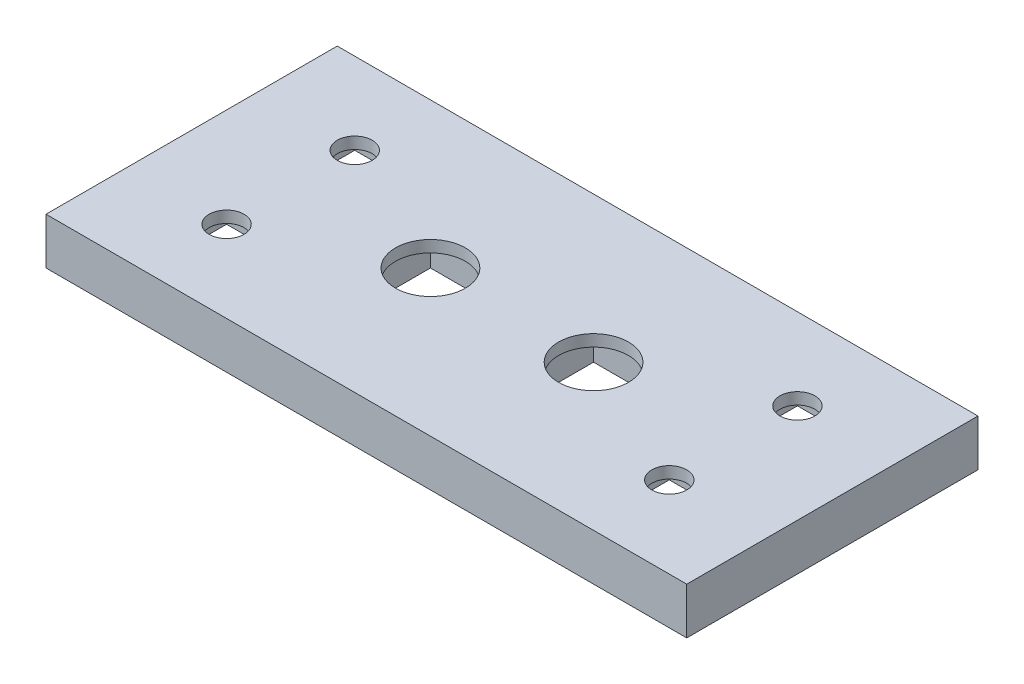
ISO-10303-21;
HEADER;
FILE_DESCRIPTION(('STEP AP214'),'2;1');
FILE_NAME('part.step','',(''),(''),'','','');
FILE_SCHEMA(('AUTOMOTIVE_DESIGN { 1 0 10303 214 1 1 1 1 }'));
ENDSEC;
DATA;
#1=APPLICATION_CONTEXT('core data for automotive mechanical design processes');
#2=APPLICATION_PROTOCOL_DEFINITION('international standard','automotive_design',2000,#1);
#3=PRODUCT_CONTEXT('',#1,'mechanical');
#4=PRODUCT('Part','Part','',(#3));
#5=PRODUCT_RELATED_PRODUCT_CATEGORY('part','',(#4));
#6=PRODUCT_DEFINITION_FORMATION('','',#4);
#7=PRODUCT_DEFINITION_CONTEXT('part definition',#1,'design');
#8=PRODUCT_DEFINITION('design','',#6,#7);
#9=PRODUCT_DEFINITION_SHAPE('','',#8);
#10=(LENGTH_UNIT() NAMED_UNIT(*) SI_UNIT(.MILLI.,.METRE.));
#11=(NAMED_UNIT(*) PLANE_ANGLE_UNIT() SI_UNIT($,.RADIAN.));
#12=(NAMED_UNIT(*) SI_UNIT($,.STERADIAN.) SOLID_ANGLE_UNIT());
#13=UNCERTAINTY_MEASURE_WITH_UNIT(LENGTH_MEASURE(1.E-05),#10,'distance_accuracy_value','');
#14=(GEOMETRIC_REPRESENTATION_CONTEXT(3) GLOBAL_UNCERTAINTY_ASSIGNED_CONTEXT((#13)) GLOBAL_UNIT_ASSIGNED_CONTEXT((#10,
#11,#12)) REPRESENTATION_CONTEXT('',''));
#15=CARTESIAN_POINT('',(0.,0.,0.));
#16=DIRECTION('',(0.,0.,1.));
#17=DIRECTION('',(1.,0.,0.));
#18=AXIS2_PLACEMENT_3D('',#15,#16,#17);
#19=CARTESIAN_POINT('',(0.,4.,0.));
#20=DIRECTION('',(0.,-1.,0.));
#21=DIRECTION('',(0.,0.,-1.));
#22=AXIS2_PLACEMENT_3D('',#19,#20,#21);
#23=PLANE('',#22);
#24=CARTESIAN_POINT('',(34.5,4.,-12.5));
#25=DIRECTION('',(0.,-1.,0.));
#26=DIRECTION('',(0.,0.,-1.));
#27=AXIS2_PLACEMENT_3D('',#24,#25,#26);
#28=CIRCLE('',#27,3.);
#29=CARTESIAN_POINT('',(34.5,4.,-15.5));
#30=VERTEX_POINT('',#29);
#31=EDGE_CURVE('E635',#30,#30,#28,.T.);
#32=ORIENTED_EDGE('',*,*,#31,.T.);
#33=EDGE_LOOP('',(#32));
#34=FACE_BOUND('',#33,.T.);
#35=CARTESIAN_POINT('',(46.5,4.,-7.));
#36=DIRECTION('',(0.,1.,0.));
#37=DIRECTION('',(0.,0.,1.));
#38=AXIS2_PLACEMENT_3D('',#35,#36,#37);
#39=CIRCLE('',#38,1.5);
#40=CARTESIAN_POINT('',(46.5,4.,-5.5));
#41=VERTEX_POINT('',#40);
#42=EDGE_CURVE('E1064',#41,#41,#39,.T.);
#43=ORIENTED_EDGE('',*,*,#42,.F.);
#44=EDGE_LOOP('',(#43));
#45=FACE_BOUND('',#44,.T.);
#46=DIRECTION('',(0.,0.,-1.));
#47=VECTOR('',#46,1.);
#48=CARTESIAN_POINT('',(0.,4.,0.));
#49=LINE('',#48,#47);
#50=CARTESIAN_POINT('',(0.,4.,0.));
#51=VERTEX_POINT('',#50);
#52=CARTESIAN_POINT('',(0.,4.,-25.));
#53=VERTEX_POINT('',#52);
#54=EDGE_CURVE('E487',#51,#53,#49,.T.);
#55=ORIENTED_EDGE('',*,*,#54,.F.);
#56=DIRECTION('',(1.,0.,0.));
#57=VECTOR('',#56,1.);
#58=CARTESIAN_POINT('',(0.,4.,0.));
#59=LINE('',#58,#57);
#60=CARTESIAN_POINT('',(55.,4.,0.));
#61=VERTEX_POINT('',#60);
#62=EDGE_CURVE('E499',#51,#61,#59,.T.);
#63=ORIENTED_EDGE('',*,*,#62,.T.);
#64=DIRECTION('',(0.,0.,-1.));
#65=VECTOR('',#64,1.);
#66=CARTESIAN_POINT('',(55.,4.,0.));
#67=LINE('',#66,#65);
#68=CARTESIAN_POINT('',(55.,4.,-25.));
#69=VERTEX_POINT('',#68);
#70=EDGE_CURVE('E496',#61,#69,#67,.T.);
#71=ORIENTED_EDGE('',*,*,#70,.T.);
#72=DIRECTION('',(1.,0.,0.));
#73=VECTOR('',#72,1.);
#74=CARTESIAN_POINT('',(0.,4.,-25.));
#75=LINE('',#74,#73);
#76=EDGE_CURVE('E491',#53,#69,#75,.T.);
#77=ORIENTED_EDGE('',*,*,#76,.F.);
#78=EDGE_LOOP('',(#55,#63,#71,#77));
#79=FACE_BOUND('',#78,.T.);
#80=CARTESIAN_POINT('',(8.5,4.,-18.));
#81=DIRECTION('',(0.,1.,0.));
#82=DIRECTION('',(0.,0.,1.));
#83=AXIS2_PLACEMENT_3D('',#80,#81,#82);
#84=CIRCLE('',#83,1.5);
#85=CARTESIAN_POINT('',(8.5,4.,-16.5));
#86=VERTEX_POINT('',#85);
#87=EDGE_CURVE('E619',#86,#86,#84,.T.);
#88=ORIENTED_EDGE('',*,*,#87,.F.);
#89=EDGE_LOOP('',(#88));
#90=FACE_BOUND('',#89,.T.);
#91=CARTESIAN_POINT('',(46.5,4.,-18.));
#92=DIRECTION('',(0.,-1.,0.));
#93=DIRECTION('',(0.,0.,-1.));
#94=AXIS2_PLACEMENT_3D('',#91,#92,#93);
#95=CIRCLE('',#94,1.5);
#96=CARTESIAN_POINT('',(46.5,4.,-19.5));
#97=VERTEX_POINT('',#96);
#98=EDGE_CURVE('E623',#97,#97,#95,.T.);
#99=ORIENTED_EDGE('',*,*,#98,.T.);
#100=EDGE_LOOP('',(#99));
#101=FACE_BOUND('',#100,.T.);
#102=CARTESIAN_POINT('',(20.5,4.,-12.5));
#103=DIRECTION('',(0.,1.,0.));
#104=DIRECTION('',(0.,0.,1.));
#105=AXIS2_PLACEMENT_3D('',#102,#103,#104);
#106=CIRCLE('',#105,3.);
#107=CARTESIAN_POINT('',(20.5,4.,-9.5));
#108=VERTEX_POINT('',#107);
#109=EDGE_CURVE('E627',#108,#108,#106,.T.);
#110=ORIENTED_EDGE('',*,*,#109,.F.);
#111=EDGE_LOOP('',(#110));
#112=FACE_BOUND('',#111,.T.);
#113=CARTESIAN_POINT('',(8.5,4.,-7.));
#114=DIRECTION('',(0.,-1.,0.));
#115=DIRECTION('',(0.,0.,-1.));
#116=AXIS2_PLACEMENT_3D('',#113,#114,#115);
#117=CIRCLE('',#116,1.5);
#118=CARTESIAN_POINT('',(8.5,4.,-8.5));
#119=VERTEX_POINT('',#118);
#120=EDGE_CURVE('E630',#119,#119,#117,.T.);
#121=ORIENTED_EDGE('',*,*,#120,.T.);
#122=EDGE_LOOP('',(#121));
#123=FACE_BOUND('',#122,.T.);
#124=ADVANCED_FACE('F39',(#34,#45,#79,#90,#101,#112,#123),#23,.F.);
#125=CARTESIAN_POINT('',(0.,0.,0.));
#126=DIRECTION('',(0.,-1.,0.));
#127=DIRECTION('',(0.,0.,-1.));
#128=AXIS2_PLACEMENT_3D('',#125,#126,#127);
#129=PLANE('',#128);
#130=DIRECTION('',(0.,0.,-1.));
#131=VECTOR('',#130,1.);
#132=CARTESIAN_POINT('',(42.5,0.,0.));
#133=LINE('',#132,#131);
#134=CARTESIAN_POINT('',(42.5,0.,-14.));
#135=VERTEX_POINT('',#134);
#136=CARTESIAN_POINT('',(42.5,0.,-22.));
#137=VERTEX_POINT('',#136);
#138=EDGE_CURVE('E57',#135,#137,#133,.T.);
#139=ORIENTED_EDGE('',*,*,#138,.F.);
#140=DIRECTION('',(-1.,0.,0.));
#141=VECTOR('',#140,1.);
#142=CARTESIAN_POINT('',(0.,0.,-14.));
#143=LINE('',#142,#141);
#144=CARTESIAN_POINT('',(50.5,0.,-14.));
#145=VERTEX_POINT('',#144);
#146=EDGE_CURVE('E298',#145,#135,#143,.T.);
#147=ORIENTED_EDGE('',*,*,#146,.F.);
#148=DIRECTION('',(0.,0.,-1.));
#149=VECTOR('',#148,1.);
#150=CARTESIAN_POINT('',(50.5,0.,0.));
#151=LINE('',#150,#149);
#152=CARTESIAN_POINT('',(50.5,0.,-22.));
#153=VERTEX_POINT('',#152);
#154=EDGE_CURVE('E293',#145,#153,#151,.T.);
#155=ORIENTED_EDGE('',*,*,#154,.T.);
#156=DIRECTION('',(-1.,0.,0.));
#157=VECTOR('',#156,1.);
#158=CARTESIAN_POINT('',(0.,0.,-22.));
#159=LINE('',#158,#157);
#160=EDGE_CURVE('E289',#153,#137,#159,.T.);
#161=ORIENTED_EDGE('',*,*,#160,.T.);
#162=EDGE_LOOP('',(#139,#147,#155,#161));
#163=FACE_BOUND('',#162,.T.);
#164=DIRECTION('',(-1.,0.,0.));
#165=VECTOR('',#164,1.);
#166=CARTESIAN_POINT('',(0.,0.,-8.5));
#167=LINE('',#166,#165);
#168=CARTESIAN_POINT('',(38.5,0.,-8.5));
#169=VERTEX_POINT('',#168);
#170=CARTESIAN_POINT('',(30.5,0.,-8.5));
#171=VERTEX_POINT('',#170);
#172=EDGE_CURVE('E65',#169,#171,#167,.T.);
#173=ORIENTED_EDGE('',*,*,#172,.F.);
#174=DIRECTION('',(0.,0.,-1.));
#175=VECTOR('',#174,1.);
#176=CARTESIAN_POINT('',(38.5,0.,0.));
#177=LINE('',#176,#175);
#178=CARTESIAN_POINT('',(38.5,0.,-16.5));
#179=VERTEX_POINT('',#178);
#180=EDGE_CURVE('E340',#169,#179,#177,.T.);
#181=ORIENTED_EDGE('',*,*,#180,.T.);
#182=DIRECTION('',(-1.,0.,0.));
#183=VECTOR('',#182,1.);
#184=CARTESIAN_POINT('',(0.,0.,-16.5));
#185=LINE('',#184,#183);
#186=CARTESIAN_POINT('',(30.5,0.,-16.5));
#187=VERTEX_POINT('',#186);
#188=EDGE_CURVE('E335',#179,#187,#185,.T.);
#189=ORIENTED_EDGE('',*,*,#188,.T.);
#190=DIRECTION('',(0.,0.,-1.));
#191=VECTOR('',#190,1.);
#192=CARTESIAN_POINT('',(30.5,0.,0.));
#193=LINE('',#192,#191);
#194=EDGE_CURVE('E331',#171,#187,#193,.T.);
#195=ORIENTED_EDGE('',*,*,#194,.F.);
#196=EDGE_LOOP('',(#173,#181,#189,#195));
#197=FACE_BOUND('',#196,.T.);
#198=DIRECTION('',(1.,0.,0.));
#199=VECTOR('',#198,1.);
#200=CARTESIAN_POINT('',(0.,0.,-11.));
#201=LINE('',#200,#199);
#202=CARTESIAN_POINT('',(4.5,0.,-11.));
#203=VERTEX_POINT('',#202);
#204=CARTESIAN_POINT('',(12.5,0.,-11.));
#205=VERTEX_POINT('',#204);
#206=EDGE_CURVE('E321',#203,#205,#201,.T.);
#207=ORIENTED_EDGE('',*,*,#206,.F.);
#208=DIRECTION('',(0.,0.,1.));
#209=VECTOR('',#208,1.);
#210=CARTESIAN_POINT('',(4.5,0.,0.));
#211=LINE('',#210,#209);
#212=CARTESIAN_POINT('',(4.5,0.,-3.));
#213=VERTEX_POINT('',#212);
#214=EDGE_CURVE('E382',#203,#213,#211,.T.);
#215=ORIENTED_EDGE('',*,*,#214,.T.);
#216=DIRECTION('',(1.,0.,0.));
#217=VECTOR('',#216,1.);
#218=CARTESIAN_POINT('',(0.,0.,-3.));
#219=LINE('',#218,#217);
#220=CARTESIAN_POINT('',(12.5,0.,-3.));
#221=VERTEX_POINT('',#220);
#222=EDGE_CURVE('E377',#213,#221,#219,.T.);
#223=ORIENTED_EDGE('',*,*,#222,.T.);
#224=DIRECTION('',(0.,0.,1.));
#225=VECTOR('',#224,1.);
#226=CARTESIAN_POINT('',(12.5,0.,0.));
#227=LINE('',#226,#225);
#228=EDGE_CURVE('E373',#205,#221,#227,.T.);
#229=ORIENTED_EDGE('',*,*,#228,.F.);
#230=EDGE_LOOP('',(#207,#215,#223,#229));
#231=FACE_BOUND('',#230,.T.);
#232=DIRECTION('',(-1.,0.,0.));
#233=VECTOR('',#232,1.);
#234=CARTESIAN_POINT('',(0.,0.,-3.));
#235=LINE('',#234,#233);
#236=CARTESIAN_POINT('',(50.5,0.,-3.));
#237=VERTEX_POINT('',#236);
#238=CARTESIAN_POINT('',(42.5,0.,-3.));
#239=VERTEX_POINT('',#238);
#240=EDGE_CURVE('E304',#237,#239,#235,.T.);
#241=ORIENTED_EDGE('',*,*,#240,.F.);
#242=DIRECTION('',(0.,0.,1.));
#243=VECTOR('',#242,1.);
#244=CARTESIAN_POINT('',(50.5,0.,0.));
#245=LINE('',#244,#243);
#246=CARTESIAN_POINT('',(50.5,0.,-11.));
#247=VERTEX_POINT('',#246);
#248=EDGE_CURVE('E462',#247,#237,#245,.T.);
#249=ORIENTED_EDGE('',*,*,#248,.F.);
#250=DIRECTION('',(-1.,0.,0.));
#251=VECTOR('',#250,1.);
#252=CARTESIAN_POINT('',(0.,0.,-11.));
#253=LINE('',#252,#251);
#254=CARTESIAN_POINT('',(42.5,0.,-11.));
#255=VERTEX_POINT('',#254);
#256=EDGE_CURVE('E466',#247,#255,#253,.T.);
#257=ORIENTED_EDGE('',*,*,#256,.T.);
#258=DIRECTION('',(0.,0.,1.));
#259=VECTOR('',#258,1.);
#260=CARTESIAN_POINT('',(42.5,0.,0.));
#261=LINE('',#260,#259);
#262=EDGE_CURVE('E448',#255,#239,#261,.T.);
#263=ORIENTED_EDGE('',*,*,#262,.T.);
#264=EDGE_LOOP('',(#241,#249,#257,#263));
#265=FACE_BOUND('',#264,.T.);
#266=DIRECTION('',(0.,0.,-1.));
#267=VECTOR('',#266,1.);
#268=CARTESIAN_POINT('',(0.,0.,0.));
#269=LINE('',#268,#267);
#270=CARTESIAN_POINT('',(0.,0.,0.));
#271=VERTEX_POINT('',#270);
#272=CARTESIAN_POINT('',(0.,0.,-25.));
#273=VERTEX_POINT('',#272);
#274=EDGE_CURVE('E486',#271,#273,#269,.T.);
#275=ORIENTED_EDGE('',*,*,#274,.T.);
#276=DIRECTION('',(1.,0.,0.));
#277=VECTOR('',#276,1.);
#278=CARTESIAN_POINT('',(0.,0.,-25.));
#279=LINE('',#278,#277);
#280=CARTESIAN_POINT('',(55.,0.,-25.));
#281=VERTEX_POINT('',#280);
#282=EDGE_CURVE('E506',#273,#281,#279,.T.);
#283=ORIENTED_EDGE('',*,*,#282,.T.);
#284=DIRECTION('',(0.,0.,-1.));
#285=VECTOR('',#284,1.);
#286=CARTESIAN_POINT('',(55.,0.,0.));
#287=LINE('',#286,#285);
#288=CARTESIAN_POINT('',(55.,0.,0.));
#289=VERTEX_POINT('',#288);
#290=EDGE_CURVE('E510',#289,#281,#287,.T.);
#291=ORIENTED_EDGE('',*,*,#290,.F.);
#292=DIRECTION('',(1.,0.,0.));
#293=VECTOR('',#292,1.);
#294=CARTESIAN_POINT('',(0.,0.,0.));
#295=LINE('',#294,#293);
#296=EDGE_CURVE('E492',#271,#289,#295,.T.);
#297=ORIENTED_EDGE('',*,*,#296,.F.);
#298=EDGE_LOOP('',(#275,#283,#291,#297));
#299=FACE_BOUND('',#298,.T.);
#300=DIRECTION('',(0.,0.,-1.));
#301=VECTOR('',#300,1.);
#302=CARTESIAN_POINT('',(4.5,0.,-14.));
#303=LINE('',#302,#301);
#304=CARTESIAN_POINT('',(4.5,0.,-14.));
#305=VERTEX_POINT('',#304);
#306=CARTESIAN_POINT('',(4.5,0.,-22.));
#307=VERTEX_POINT('',#306);
#308=EDGE_CURVE('E245',#305,#307,#303,.T.);
#309=ORIENTED_EDGE('',*,*,#308,.F.);
#310=DIRECTION('',(1.,0.,0.));
#311=VECTOR('',#310,1.);
#312=CARTESIAN_POINT('',(4.5,0.,-14.));
#313=LINE('',#312,#311);
#314=CARTESIAN_POINT('',(12.5,0.,-14.));
#315=VERTEX_POINT('',#314);
#316=EDGE_CURVE('E258',#305,#315,#313,.T.);
#317=ORIENTED_EDGE('',*,*,#316,.T.);
#318=DIRECTION('',(0.,0.,-1.));
#319=VECTOR('',#318,1.);
#320=CARTESIAN_POINT('',(12.5,0.,-14.));
#321=LINE('',#320,#319);
#322=CARTESIAN_POINT('',(12.5,0.,-22.));
#323=VERTEX_POINT('',#322);
#324=EDGE_CURVE('E254',#315,#323,#321,.T.);
#325=ORIENTED_EDGE('',*,*,#324,.T.);
#326=DIRECTION('',(1.,0.,0.));
#327=VECTOR('',#326,1.);
#328=CARTESIAN_POINT('',(4.5,0.,-22.));
#329=LINE('',#328,#327);
#330=EDGE_CURVE('E232',#307,#323,#329,.T.);
#331=ORIENTED_EDGE('',*,*,#330,.F.);
#332=EDGE_LOOP('',(#309,#317,#325,#331));
#333=FACE_BOUND('',#332,.T.);
#334=DIRECTION('',(0.,0.,-1.));
#335=VECTOR('',#334,1.);
#336=CARTESIAN_POINT('',(16.5,0.,-8.5));
#337=LINE('',#336,#335);
#338=CARTESIAN_POINT('',(16.5,0.,-8.5));
#339=VERTEX_POINT('',#338);
#340=CARTESIAN_POINT('',(16.5,0.,-16.5));
#341=VERTEX_POINT('',#340);
#342=EDGE_CURVE('E414',#339,#341,#337,.T.);
#343=ORIENTED_EDGE('',*,*,#342,.F.);
#344=DIRECTION('',(1.,0.,0.));
#345=VECTOR('',#344,1.);
#346=CARTESIAN_POINT('',(16.5,0.,-8.5));
#347=LINE('',#346,#345);
#348=CARTESIAN_POINT('',(24.5,0.,-8.5));
#349=VERTEX_POINT('',#348);
#350=EDGE_CURVE('E362',#339,#349,#347,.T.);
#351=ORIENTED_EDGE('',*,*,#350,.T.);
#352=DIRECTION('',(0.,0.,-1.));
#353=VECTOR('',#352,1.);
#354=CARTESIAN_POINT('',(24.5,0.,-8.5));
#355=LINE('',#354,#353);
#356=CARTESIAN_POINT('',(24.5,0.,-16.5));
#357=VERTEX_POINT('',#356);
#358=EDGE_CURVE('E423',#349,#357,#355,.T.);
#359=ORIENTED_EDGE('',*,*,#358,.T.);
#360=DIRECTION('',(1.,0.,0.));
#361=VECTOR('',#360,1.);
#362=CARTESIAN_POINT('',(16.5,0.,-16.5));
#363=LINE('',#362,#361);
#364=EDGE_CURVE('E418',#341,#357,#363,.T.);
#365=ORIENTED_EDGE('',*,*,#364,.F.);
#366=EDGE_LOOP('',(#343,#351,#359,#365));
#367=FACE_BOUND('',#366,.T.);
#368=ADVANCED_FACE('F252',(#163,#197,#231,#265,#299,#333,#367),#129,.T.);
#369=CARTESIAN_POINT('',(0.,4.,0.));
#370=DIRECTION('',(-1.,0.,0.));
#371=DIRECTION('',(0.,0.,1.));
#372=AXIS2_PLACEMENT_3D('',#369,#370,#371);
#373=PLANE('',#372);
#374=ORIENTED_EDGE('',*,*,#274,.F.);
#375=DIRECTION('',(0.,-1.,0.));
#376=VECTOR('',#375,1.);
#377=CARTESIAN_POINT('',(0.,4.,0.));
#378=LINE('',#377,#376);
#379=EDGE_CURVE('E11',#51,#271,#378,.T.);
#380=ORIENTED_EDGE('',*,*,#379,.F.);
#381=ORIENTED_EDGE('',*,*,#54,.T.);
#382=DIRECTION('',(0.,-1.,0.));
#383=VECTOR('',#382,1.);
#384=CARTESIAN_POINT('',(0.,4.,-25.));
#385=LINE('',#384,#383);
#386=EDGE_CURVE('E502',#53,#273,#385,.T.);
#387=ORIENTED_EDGE('',*,*,#386,.T.);
#388=EDGE_LOOP('',(#374,#380,#381,#387));
#389=FACE_BOUND('',#388,.T.);
#390=ADVANCED_FACE('F41',(#389),#373,.T.);
#391=CARTESIAN_POINT('',(0.,4.,0.));
#392=DIRECTION('',(0.,0.,-1.));
#393=DIRECTION('',(-1.,0.,0.));
#394=AXIS2_PLACEMENT_3D('',#391,#392,#393);
#395=PLANE('',#394);
#396=ORIENTED_EDGE('',*,*,#296,.T.);
#397=DIRECTION('',(0.,-1.,0.));
#398=VECTOR('',#397,1.);
#399=CARTESIAN_POINT('',(55.,4.,0.));
#400=LINE('',#399,#398);
#401=EDGE_CURVE('E49',#61,#289,#400,.T.);
#402=ORIENTED_EDGE('',*,*,#401,.F.);
#403=ORIENTED_EDGE('',*,*,#62,.F.);
#404=ORIENTED_EDGE('',*,*,#379,.T.);
#405=EDGE_LOOP('',(#396,#402,#403,#404));
#406=FACE_BOUND('',#405,.T.);
#407=ADVANCED_FACE('F587',(#406),#395,.F.);
#408=CARTESIAN_POINT('',(55.,4.,0.));
#409=DIRECTION('',(-1.,0.,0.));
#410=DIRECTION('',(0.,0.,1.));
#411=AXIS2_PLACEMENT_3D('',#408,#409,#410);
#412=PLANE('',#411);
#413=ORIENTED_EDGE('',*,*,#290,.T.);
#414=DIRECTION('',(0.,-1.,0.));
#415=VECTOR('',#414,1.);
#416=CARTESIAN_POINT('',(55.,4.,-25.));
#417=LINE('',#416,#415);
#418=EDGE_CURVE('E519',#69,#281,#417,.T.);
#419=ORIENTED_EDGE('',*,*,#418,.F.);
#420=ORIENTED_EDGE('',*,*,#70,.F.);
#421=ORIENTED_EDGE('',*,*,#401,.T.);
#422=EDGE_LOOP('',(#413,#419,#420,#421));
#423=FACE_BOUND('',#422,.T.);
#424=ADVANCED_FACE('F590',(#423),#412,.F.);
#425=CARTESIAN_POINT('',(0.,4.,-25.));
#426=DIRECTION('',(0.,0.,-1.));
#427=DIRECTION('',(-1.,0.,0.));
#428=AXIS2_PLACEMENT_3D('',#425,#426,#427);
#429=PLANE('',#428);
#430=ORIENTED_EDGE('',*,*,#282,.F.);
#431=ORIENTED_EDGE('',*,*,#386,.F.);
#432=ORIENTED_EDGE('',*,*,#76,.T.);
#433=ORIENTED_EDGE('',*,*,#418,.T.);
#434=EDGE_LOOP('',(#430,#431,#432,#433));
#435=FACE_BOUND('',#434,.T.);
#436=ADVANCED_FACE('F593',(#435),#429,.T.);
#437=CARTESIAN_POINT('',(0.,3.,-3.));
#438=DIRECTION('',(0.,0.,1.));
#439=DIRECTION('',(1.,0.,0.));
#440=AXIS2_PLACEMENT_3D('',#437,#438,#439);
#441=PLANE('',#440);
#442=ORIENTED_EDGE('',*,*,#240,.T.);
#443=DIRECTION('',(0.,-1.,0.));
#444=VECTOR('',#443,1.);
#445=CARTESIAN_POINT('',(42.5,3.,-3.));
#446=LINE('',#445,#444);
#447=CARTESIAN_POINT('',(42.5,3.,-3.));
#448=VERTEX_POINT('',#447);
#449=EDGE_CURVE('E459',#448,#239,#446,.T.);
#450=ORIENTED_EDGE('',*,*,#449,.F.);
#451=DIRECTION('',(-1.,0.,0.));
#452=VECTOR('',#451,1.);
#453=CARTESIAN_POINT('',(0.,3.,-3.));
#454=LINE('',#453,#452);
#455=CARTESIAN_POINT('',(50.5,3.,-3.));
#456=VERTEX_POINT('',#455);
#457=EDGE_CURVE('E443',#456,#448,#454,.T.);
#458=ORIENTED_EDGE('',*,*,#457,.F.);
#459=DIRECTION('',(0.,-1.,0.));
#460=VECTOR('',#459,1.);
#461=CARTESIAN_POINT('',(50.5,3.,-3.));
#462=LINE('',#461,#460);
#463=EDGE_CURVE('E483',#456,#237,#462,.T.);
#464=ORIENTED_EDGE('',*,*,#463,.T.);
#465=EDGE_LOOP('',(#442,#450,#458,#464));
#466=FACE_BOUND('',#465,.T.);
#467=ADVANCED_FACE('F584',(#466),#441,.F.);
#468=CARTESIAN_POINT('',(50.5,3.,0.));
#469=DIRECTION('',(1.,0.,0.));
#470=DIRECTION('',(0.,0.,-1.));
#471=AXIS2_PLACEMENT_3D('',#468,#469,#470);
#472=PLANE('',#471);
#473=ORIENTED_EDGE('',*,*,#248,.T.);
#474=ORIENTED_EDGE('',*,*,#463,.F.);
#475=DIRECTION('',(0.,0.,1.));
#476=VECTOR('',#475,1.);
#477=CARTESIAN_POINT('',(50.5,3.,0.));
#478=LINE('',#477,#476);
#479=CARTESIAN_POINT('',(50.5,3.,-11.));
#480=VERTEX_POINT('',#479);
#481=EDGE_CURVE('E447',#480,#456,#478,.T.);
#482=ORIENTED_EDGE('',*,*,#481,.F.);
#483=DIRECTION('',(0.,-1.,0.));
#484=VECTOR('',#483,1.);
#485=CARTESIAN_POINT('',(50.5,3.,-11.));
#486=LINE('',#485,#484);
#487=EDGE_CURVE('E480',#480,#247,#486,.T.);
#488=ORIENTED_EDGE('',*,*,#487,.T.);
#489=EDGE_LOOP('',(#473,#474,#482,#488));
#490=FACE_BOUND('',#489,.T.);
#491=ADVANCED_FACE('F600',(#490),#472,.F.);
#492=CARTESIAN_POINT('',(0.,3.,-11.));
#493=DIRECTION('',(0.,0.,1.));
#494=DIRECTION('',(1.,0.,0.));
#495=AXIS2_PLACEMENT_3D('',#492,#493,#494);
#496=PLANE('',#495);
#497=ORIENTED_EDGE('',*,*,#256,.F.);
#498=ORIENTED_EDGE('',*,*,#487,.F.);
#499=DIRECTION('',(-1.,0.,0.));
#500=VECTOR('',#499,1.);
#501=CARTESIAN_POINT('',(0.,3.,-11.));
#502=LINE('',#501,#500);
#503=CARTESIAN_POINT('',(42.5,3.,-11.));
#504=VERTEX_POINT('',#503);
#505=EDGE_CURVE('E452',#480,#504,#502,.T.);
#506=ORIENTED_EDGE('',*,*,#505,.T.);
#507=DIRECTION('',(0.,-1.,0.));
#508=VECTOR('',#507,1.);
#509=CARTESIAN_POINT('',(42.5,3.,-11.));
#510=LINE('',#509,#508);
#511=EDGE_CURVE('E476',#504,#255,#510,.T.);
#512=ORIENTED_EDGE('',*,*,#511,.T.);
#513=EDGE_LOOP('',(#497,#498,#506,#512));
#514=FACE_BOUND('',#513,.T.);
#515=ADVANCED_FACE('F762',(#514),#496,.T.);
#516=CARTESIAN_POINT('',(42.5,3.,0.));
#517=DIRECTION('',(1.,0.,0.));
#518=DIRECTION('',(0.,0.,-1.));
#519=AXIS2_PLACEMENT_3D('',#516,#517,#518);
#520=PLANE('',#519);
#521=ORIENTED_EDGE('',*,*,#262,.F.);
#522=ORIENTED_EDGE('',*,*,#511,.F.);
#523=DIRECTION('',(0.,0.,1.));
#524=VECTOR('',#523,1.);
#525=CARTESIAN_POINT('',(42.5,3.,0.));
#526=LINE('',#525,#524);
#527=EDGE_CURVE('E456',#504,#448,#526,.T.);
#528=ORIENTED_EDGE('',*,*,#527,.T.);
#529=ORIENTED_EDGE('',*,*,#449,.T.);
#530=EDGE_LOOP('',(#521,#522,#528,#529));
#531=FACE_BOUND('',#530,.T.);
#532=ADVANCED_FACE('F569',(#531),#520,.T.);
#533=CARTESIAN_POINT('',(0.,3.,0.));
#534=DIRECTION('',(0.,1.,0.));
#535=DIRECTION('',(0.,0.,1.));
#536=AXIS2_PLACEMENT_3D('',#533,#534,#535);
#537=PLANE('',#536);
#538=CARTESIAN_POINT('',(46.5,3.,-7.));
#539=DIRECTION('',(0.,1.,0.));
#540=DIRECTION('',(0.,0.,1.));
#541=AXIS2_PLACEMENT_3D('',#538,#539,#540);
#542=CIRCLE('',#541,1.5);
#543=CARTESIAN_POINT('',(46.5,3.,-5.5));
#544=VERTEX_POINT('',#543);
#545=EDGE_CURVE('E532',#544,#544,#542,.F.);
#546=ORIENTED_EDGE('',*,*,#545,.F.);
#547=EDGE_LOOP('',(#546));
#548=FACE_BOUND('',#547,.T.);
#549=ORIENTED_EDGE('',*,*,#457,.T.);
#550=ORIENTED_EDGE('',*,*,#527,.F.);
#551=ORIENTED_EDGE('',*,*,#505,.F.);
#552=ORIENTED_EDGE('',*,*,#481,.T.);
#553=EDGE_LOOP('',(#549,#550,#551,#552));
#554=FACE_BOUND('',#553,.T.);
#555=ADVANCED_FACE('F562',(#548,#554),#537,.F.);
#556=CARTESIAN_POINT('',(4.5,3.,-14.));
#557=DIRECTION('',(0.,0.,-1.));
#558=DIRECTION('',(-1.,0.,0.));
#559=AXIS2_PLACEMENT_3D('',#556,#557,#558);
#560=PLANE('',#559);
#561=ORIENTED_EDGE('',*,*,#316,.F.);
#562=DIRECTION('',(0.,-1.,0.));
#563=VECTOR('',#562,1.);
#564=CARTESIAN_POINT('',(4.5,3.,-14.));
#565=LINE('',#564,#563);
#566=CARTESIAN_POINT('',(4.5,3.,-14.));
#567=VERTEX_POINT('',#566);
#568=EDGE_CURVE('E240',#567,#305,#565,.T.);
#569=ORIENTED_EDGE('',*,*,#568,.F.);
#570=DIRECTION('',(1.,0.,0.));
#571=VECTOR('',#570,1.);
#572=CARTESIAN_POINT('',(4.5,3.,-14.));
#573=LINE('',#572,#571);
#574=CARTESIAN_POINT('',(12.5,3.,-14.));
#575=VERTEX_POINT('',#574);
#576=EDGE_CURVE('E250',#567,#575,#573,.T.);
#577=ORIENTED_EDGE('',*,*,#576,.T.);
#578=DIRECTION('',(0.,-1.,0.));
#579=VECTOR('',#578,1.);
#580=CARTESIAN_POINT('',(12.5,3.,-14.));
#581=LINE('',#580,#579);
#582=EDGE_CURVE('E547',#575,#315,#581,.T.);
#583=ORIENTED_EDGE('',*,*,#582,.T.);
#584=EDGE_LOOP('',(#561,#569,#577,#583));
#585=FACE_BOUND('',#584,.T.);
#586=ADVANCED_FACE('F560',(#585),#560,.T.);
#587=CARTESIAN_POINT('',(12.5,3.,-14.));
#588=DIRECTION('',(-1.,0.,0.));
#589=DIRECTION('',(0.,0.,1.));
#590=AXIS2_PLACEMENT_3D('',#587,#588,#589);
#591=PLANE('',#590);
#592=ORIENTED_EDGE('',*,*,#324,.F.);
#593=ORIENTED_EDGE('',*,*,#582,.F.);
#594=DIRECTION('',(0.,0.,-1.));
#595=VECTOR('',#594,1.);
#596=CARTESIAN_POINT('',(12.5,3.,-14.));
#597=LINE('',#596,#595);
#598=CARTESIAN_POINT('',(12.5,3.,-22.));
#599=VERTEX_POINT('',#598);
#600=EDGE_CURVE('E270',#575,#599,#597,.T.);
#601=ORIENTED_EDGE('',*,*,#600,.T.);
#602=DIRECTION('',(0.,-1.,0.));
#603=VECTOR('',#602,1.);
#604=CARTESIAN_POINT('',(12.5,3.,-22.));
#605=LINE('',#604,#603);
#606=EDGE_CURVE('E241',#599,#323,#605,.T.);
#607=ORIENTED_EDGE('',*,*,#606,.T.);
#608=EDGE_LOOP('',(#592,#593,#601,#607));
#609=FACE_BOUND('',#608,.T.);
#610=ADVANCED_FACE('F554',(#609),#591,.T.);
#611=CARTESIAN_POINT('',(4.5,3.,-22.));
#612=DIRECTION('',(0.,0.,-1.));
#613=DIRECTION('',(-1.,0.,0.));
#614=AXIS2_PLACEMENT_3D('',#611,#612,#613);
#615=PLANE('',#614);
#616=ORIENTED_EDGE('',*,*,#330,.T.);
#617=ORIENTED_EDGE('',*,*,#606,.F.);
#618=DIRECTION('',(1.,0.,0.));
#619=VECTOR('',#618,1.);
#620=CARTESIAN_POINT('',(4.5,3.,-22.));
#621=LINE('',#620,#619);
#622=CARTESIAN_POINT('',(4.5,3.,-22.));
#623=VERTEX_POINT('',#622);
#624=EDGE_CURVE('E235',#623,#599,#621,.T.);
#625=ORIENTED_EDGE('',*,*,#624,.F.);
#626=DIRECTION('',(0.,-1.,0.));
#627=VECTOR('',#626,1.);
#628=CARTESIAN_POINT('',(4.5,3.,-22.));
#629=LINE('',#628,#627);
#630=EDGE_CURVE('E227',#623,#307,#629,.T.);
#631=ORIENTED_EDGE('',*,*,#630,.T.);
#632=EDGE_LOOP('',(#616,#617,#625,#631));
#633=FACE_BOUND('',#632,.T.);
#634=ADVANCED_FACE('F229',(#633),#615,.F.);
#635=CARTESIAN_POINT('',(4.5,3.,-14.));
#636=DIRECTION('',(-1.,0.,0.));
#637=DIRECTION('',(0.,0.,1.));
#638=AXIS2_PLACEMENT_3D('',#635,#636,#637);
#639=PLANE('',#638);
#640=ORIENTED_EDGE('',*,*,#308,.T.);
#641=ORIENTED_EDGE('',*,*,#630,.F.);
#642=DIRECTION('',(0.,0.,-1.));
#643=VECTOR('',#642,1.);
#644=CARTESIAN_POINT('',(4.5,3.,-14.));
#645=LINE('',#644,#643);
#646=EDGE_CURVE('E265',#567,#623,#645,.T.);
#647=ORIENTED_EDGE('',*,*,#646,.F.);
#648=ORIENTED_EDGE('',*,*,#568,.T.);
#649=EDGE_LOOP('',(#640,#641,#647,#648));
#650=FACE_BOUND('',#649,.T.);
#651=ADVANCED_FACE('F246',(#650),#639,.F.);
#652=CARTESIAN_POINT('',(0.,3.,0.));
#653=DIRECTION('',(0.,1.,0.));
#654=DIRECTION('',(0.,0.,1.));
#655=AXIS2_PLACEMENT_3D('',#652,#653,#654);
#656=PLANE('',#655);
#657=CARTESIAN_POINT('',(8.5,3.,-18.));
#658=DIRECTION('',(0.,1.,0.));
#659=DIRECTION('',(0.,0.,1.));
#660=AXIS2_PLACEMENT_3D('',#657,#658,#659);
#661=CIRCLE('',#660,1.5);
#662=CARTESIAN_POINT('',(8.5,3.,-16.5));
#663=VERTEX_POINT('',#662);
#664=EDGE_CURVE('E43',#663,#663,#661,.F.);
#665=ORIENTED_EDGE('',*,*,#664,.F.);
#666=EDGE_LOOP('',(#665));
#667=FACE_BOUND('',#666,.T.);
#668=ORIENTED_EDGE('',*,*,#576,.F.);
#669=ORIENTED_EDGE('',*,*,#646,.T.);
#670=ORIENTED_EDGE('',*,*,#624,.T.);
#671=ORIENTED_EDGE('',*,*,#600,.F.);
#672=EDGE_LOOP('',(#668,#669,#670,#671));
#673=FACE_BOUND('',#672,.T.);
#674=ADVANCED_FACE('F558',(#667,#673),#656,.F.);
#675=CARTESIAN_POINT('',(16.5,3.,-8.5));
#676=DIRECTION('',(0.,0.,-1.));
#677=DIRECTION('',(-1.,0.,0.));
#678=AXIS2_PLACEMENT_3D('',#675,#676,#677);
#679=PLANE('',#678);
#680=ORIENTED_EDGE('',*,*,#350,.F.);
#681=DIRECTION('',(0.,-1.,0.));
#682=VECTOR('',#681,1.);
#683=CARTESIAN_POINT('',(16.5,3.,-8.5));
#684=LINE('',#683,#682);
#685=CARTESIAN_POINT('',(16.5,3.,-8.5));
#686=VERTEX_POINT('',#685);
#687=EDGE_CURVE('E409',#686,#339,#684,.T.);
#688=ORIENTED_EDGE('',*,*,#687,.F.);
#689=DIRECTION('',(1.,0.,0.));
#690=VECTOR('',#689,1.);
#691=CARTESIAN_POINT('',(16.5,3.,-8.5));
#692=LINE('',#691,#690);
#693=CARTESIAN_POINT('',(24.5,3.,-8.5));
#694=VERTEX_POINT('',#693);
#695=EDGE_CURVE('E419',#686,#694,#692,.T.);
#696=ORIENTED_EDGE('',*,*,#695,.T.);
#697=DIRECTION('',(0.,-1.,0.));
#698=VECTOR('',#697,1.);
#699=CARTESIAN_POINT('',(24.5,3.,-8.5));
#700=LINE('',#699,#698);
#701=EDGE_CURVE('E264',#694,#349,#700,.T.);
#702=ORIENTED_EDGE('',*,*,#701,.T.);
#703=EDGE_LOOP('',(#680,#688,#696,#702));
#704=FACE_BOUND('',#703,.T.);
#705=ADVANCED_FACE('F680',(#704),#679,.T.);
#706=CARTESIAN_POINT('',(24.5,3.,-8.5));
#707=DIRECTION('',(-1.,0.,0.));
#708=DIRECTION('',(0.,0.,1.));
#709=AXIS2_PLACEMENT_3D('',#706,#707,#708);
#710=PLANE('',#709);
#711=ORIENTED_EDGE('',*,*,#358,.F.);
#712=ORIENTED_EDGE('',*,*,#701,.F.);
#713=DIRECTION('',(0.,0.,-1.));
#714=VECTOR('',#713,1.);
#715=CARTESIAN_POINT('',(24.5,3.,-8.5));
#716=LINE('',#715,#714);
#717=CARTESIAN_POINT('',(24.5,3.,-16.5));
#718=VERTEX_POINT('',#717);
#719=EDGE_CURVE('E437',#694,#718,#716,.T.);
#720=ORIENTED_EDGE('',*,*,#719,.T.);
#721=DIRECTION('',(0.,-1.,0.));
#722=VECTOR('',#721,1.);
#723=CARTESIAN_POINT('',(24.5,3.,-16.5));
#724=LINE('',#723,#722);
#725=EDGE_CURVE('E403',#718,#357,#724,.T.);
#726=ORIENTED_EDGE('',*,*,#725,.T.);
#727=EDGE_LOOP('',(#711,#712,#720,#726));
#728=FACE_BOUND('',#727,.T.);
#729=ADVANCED_FACE('F686',(#728),#710,.T.);
#730=CARTESIAN_POINT('',(16.5,3.,-16.5));
#731=DIRECTION('',(0.,0.,-1.));
#732=DIRECTION('',(-1.,0.,0.));
#733=AXIS2_PLACEMENT_3D('',#730,#731,#732);
#734=PLANE('',#733);
#735=ORIENTED_EDGE('',*,*,#364,.T.);
#736=ORIENTED_EDGE('',*,*,#725,.F.);
#737=DIRECTION('',(1.,0.,0.));
#738=VECTOR('',#737,1.);
#739=CARTESIAN_POINT('',(16.5,3.,-16.5));
#740=LINE('',#739,#738);
#741=CARTESIAN_POINT('',(16.5,3.,-16.5));
#742=VERTEX_POINT('',#741);
#743=EDGE_CURVE('E433',#742,#718,#740,.T.);
#744=ORIENTED_EDGE('',*,*,#743,.F.);
#745=DIRECTION('',(0.,-1.,0.));
#746=VECTOR('',#745,1.);
#747=CARTESIAN_POINT('',(16.5,3.,-16.5));
#748=LINE('',#747,#746);
#749=EDGE_CURVE('E406',#742,#341,#748,.T.);
#750=ORIENTED_EDGE('',*,*,#749,.T.);
#751=EDGE_LOOP('',(#735,#736,#744,#750));
#752=FACE_BOUND('',#751,.T.);
#753=ADVANCED_FACE('F748',(#752),#734,.F.);
#754=CARTESIAN_POINT('',(16.5,3.,-8.5));
#755=DIRECTION('',(-1.,0.,0.));
#756=DIRECTION('',(0.,0.,1.));
#757=AXIS2_PLACEMENT_3D('',#754,#755,#756);
#758=PLANE('',#757);
#759=ORIENTED_EDGE('',*,*,#342,.T.);
#760=ORIENTED_EDGE('',*,*,#749,.F.);
#761=DIRECTION('',(0.,0.,-1.));
#762=VECTOR('',#761,1.);
#763=CARTESIAN_POINT('',(16.5,3.,-8.5));
#764=LINE('',#763,#762);
#765=EDGE_CURVE('E413',#686,#742,#764,.T.);
#766=ORIENTED_EDGE('',*,*,#765,.F.);
#767=ORIENTED_EDGE('',*,*,#687,.T.);
#768=EDGE_LOOP('',(#759,#760,#766,#767));
#769=FACE_BOUND('',#768,.T.);
#770=ADVANCED_FACE('F752',(#769),#758,.F.);
#771=CARTESIAN_POINT('',(0.,3.,0.));
#772=DIRECTION('',(0.,1.,0.));
#773=DIRECTION('',(0.,0.,1.));
#774=AXIS2_PLACEMENT_3D('',#771,#772,#773);
#775=PLANE('',#774);
#776=CARTESIAN_POINT('',(20.5,3.,-12.5));
#777=DIRECTION('',(0.,1.,0.));
#778=DIRECTION('',(0.,0.,1.));
#779=AXIS2_PLACEMENT_3D('',#776,#777,#778);
#780=CIRCLE('',#779,3.);
#781=CARTESIAN_POINT('',(20.5,3.,-9.5));
#782=VERTEX_POINT('',#781);
#783=EDGE_CURVE('E523',#782,#782,#780,.F.);
#784=ORIENTED_EDGE('',*,*,#783,.F.);
#785=EDGE_LOOP('',(#784));
#786=FACE_BOUND('',#785,.T.);
#787=ORIENTED_EDGE('',*,*,#695,.F.);
#788=ORIENTED_EDGE('',*,*,#765,.T.);
#789=ORIENTED_EDGE('',*,*,#743,.T.);
#790=ORIENTED_EDGE('',*,*,#719,.F.);
#791=EDGE_LOOP('',(#787,#788,#789,#790));
#792=FACE_BOUND('',#791,.T.);
#793=ADVANCED_FACE('F730',(#786,#792),#775,.F.);
#794=CARTESIAN_POINT('',(0.,3.,-11.));
#795=DIRECTION('',(0.,0.,-1.));
#796=DIRECTION('',(-1.,0.,0.));
#797=AXIS2_PLACEMENT_3D('',#794,#795,#796);
#798=PLANE('',#797);
#799=ORIENTED_EDGE('',*,*,#206,.T.);
#800=DIRECTION('',(0.,-1.,0.));
#801=VECTOR('',#800,1.);
#802=CARTESIAN_POINT('',(12.5,3.,-11.));
#803=LINE('',#802,#801);
#804=CARTESIAN_POINT('',(12.5,3.,-11.));
#805=VERTEX_POINT('',#804);
#806=EDGE_CURVE('E368',#805,#205,#803,.T.);
#807=ORIENTED_EDGE('',*,*,#806,.F.);
#808=DIRECTION('',(1.,0.,0.));
#809=VECTOR('',#808,1.);
#810=CARTESIAN_POINT('',(0.,3.,-11.));
#811=LINE('',#810,#809);
#812=CARTESIAN_POINT('',(4.5,3.,-11.));
#813=VERTEX_POINT('',#812);
#814=EDGE_CURVE('E378',#813,#805,#811,.T.);
#815=ORIENTED_EDGE('',*,*,#814,.F.);
#816=DIRECTION('',(0.,-1.,0.));
#817=VECTOR('',#816,1.);
#818=CARTESIAN_POINT('',(4.5,3.,-11.));
#819=LINE('',#818,#817);
#820=EDGE_CURVE('E358',#813,#203,#819,.T.);
#821=ORIENTED_EDGE('',*,*,#820,.T.);
#822=EDGE_LOOP('',(#799,#807,#815,#821));
#823=FACE_BOUND('',#822,.T.);
#824=ADVANCED_FACE('F726',(#823),#798,.F.);
#825=CARTESIAN_POINT('',(4.5,3.,0.));
#826=DIRECTION('',(1.,0.,0.));
#827=DIRECTION('',(0.,0.,-1.));
#828=AXIS2_PLACEMENT_3D('',#825,#826,#827);
#829=PLANE('',#828);
#830=ORIENTED_EDGE('',*,*,#214,.F.);
#831=ORIENTED_EDGE('',*,*,#820,.F.);
#832=DIRECTION('',(0.,0.,1.));
#833=VECTOR('',#832,1.);
#834=CARTESIAN_POINT('',(4.5,3.,0.));
#835=LINE('',#834,#833);
#836=CARTESIAN_POINT('',(4.5,3.,-3.));
#837=VERTEX_POINT('',#836);
#838=EDGE_CURVE('E394',#813,#837,#835,.T.);
#839=ORIENTED_EDGE('',*,*,#838,.T.);
#840=DIRECTION('',(0.,-1.,0.));
#841=VECTOR('',#840,1.);
#842=CARTESIAN_POINT('',(4.5,3.,-3.));
#843=LINE('',#842,#841);
#844=EDGE_CURVE('E361',#837,#213,#843,.T.);
#845=ORIENTED_EDGE('',*,*,#844,.T.);
#846=EDGE_LOOP('',(#830,#831,#839,#845));
#847=FACE_BOUND('',#846,.T.);
#848=ADVANCED_FACE('F729',(#847),#829,.T.);
#849=CARTESIAN_POINT('',(0.,3.,-3.));
#850=DIRECTION('',(0.,0.,-1.));
#851=DIRECTION('',(-1.,0.,0.));
#852=AXIS2_PLACEMENT_3D('',#849,#850,#851);
#853=PLANE('',#852);
#854=ORIENTED_EDGE('',*,*,#222,.F.);
#855=ORIENTED_EDGE('',*,*,#844,.F.);
#856=DIRECTION('',(1.,0.,0.));
#857=VECTOR('',#856,1.);
#858=CARTESIAN_POINT('',(0.,3.,-3.));
#859=LINE('',#858,#857);
#860=CARTESIAN_POINT('',(12.5,3.,-3.));
#861=VERTEX_POINT('',#860);
#862=EDGE_CURVE('E391',#837,#861,#859,.T.);
#863=ORIENTED_EDGE('',*,*,#862,.T.);
#864=DIRECTION('',(0.,-1.,0.));
#865=VECTOR('',#864,1.);
#866=CARTESIAN_POINT('',(12.5,3.,-3.));
#867=LINE('',#866,#865);
#868=EDGE_CURVE('E365',#861,#221,#867,.T.);
#869=ORIENTED_EDGE('',*,*,#868,.T.);
#870=EDGE_LOOP('',(#854,#855,#863,#869));
#871=FACE_BOUND('',#870,.T.);
#872=ADVANCED_FACE('F734',(#871),#853,.T.);
#873=CARTESIAN_POINT('',(12.5,3.,0.));
#874=DIRECTION('',(1.,0.,0.));
#875=DIRECTION('',(0.,0.,-1.));
#876=AXIS2_PLACEMENT_3D('',#873,#874,#875);
#877=PLANE('',#876);
#878=ORIENTED_EDGE('',*,*,#228,.T.);
#879=ORIENTED_EDGE('',*,*,#868,.F.);
#880=DIRECTION('',(0.,0.,1.));
#881=VECTOR('',#880,1.);
#882=CARTESIAN_POINT('',(12.5,3.,0.));
#883=LINE('',#882,#881);
#884=EDGE_CURVE('E372',#805,#861,#883,.T.);
#885=ORIENTED_EDGE('',*,*,#884,.F.);
#886=ORIENTED_EDGE('',*,*,#806,.T.);
#887=EDGE_LOOP('',(#878,#879,#885,#886));
#888=FACE_BOUND('',#887,.T.);
#889=ADVANCED_FACE('F738',(#888),#877,.F.);
#890=CARTESIAN_POINT('',(0.,3.,0.));
#891=DIRECTION('',(0.,1.,0.));
#892=DIRECTION('',(0.,0.,1.));
#893=AXIS2_PLACEMENT_3D('',#890,#891,#892);
#894=PLANE('',#893);
#895=ORIENTED_EDGE('',*,*,#814,.T.);
#896=ORIENTED_EDGE('',*,*,#884,.T.);
#897=ORIENTED_EDGE('',*,*,#862,.F.);
#898=ORIENTED_EDGE('',*,*,#838,.F.);
#899=EDGE_LOOP('',(#895,#896,#897,#898));
#900=FACE_BOUND('',#899,.T.);
#901=CARTESIAN_POINT('',(8.5,3.,-7.));
#902=DIRECTION('',(0.,1.,0.));
#903=DIRECTION('',(0.,0.,1.));
#904=AXIS2_PLACEMENT_3D('',#901,#902,#903);
#905=CIRCLE('',#904,1.5);
#906=CARTESIAN_POINT('',(8.5,3.,-5.5));
#907=VERTEX_POINT('',#906);
#908=EDGE_CURVE('E526',#907,#907,#905,.T.);
#909=ORIENTED_EDGE('',*,*,#908,.T.);
#910=EDGE_LOOP('',(#909));
#911=FACE_BOUND('',#910,.T.);
#912=ADVANCED_FACE('F711',(#900,#911),#894,.F.);
#913=CARTESIAN_POINT('',(0.,3.,-8.5));
#914=DIRECTION('',(0.,0.,1.));
#915=DIRECTION('',(1.,0.,0.));
#916=AXIS2_PLACEMENT_3D('',#913,#914,#915);
#917=PLANE('',#916);
#918=ORIENTED_EDGE('',*,*,#172,.T.);
#919=DIRECTION('',(0.,-1.,0.));
#920=VECTOR('',#919,1.);
#921=CARTESIAN_POINT('',(30.5,3.,-8.5));
#922=LINE('',#921,#920);
#923=CARTESIAN_POINT('',(30.5,3.,-8.5));
#924=VERTEX_POINT('',#923);
#925=EDGE_CURVE('E327',#924,#171,#922,.T.);
#926=ORIENTED_EDGE('',*,*,#925,.F.);
#927=DIRECTION('',(-1.,0.,0.));
#928=VECTOR('',#927,1.);
#929=CARTESIAN_POINT('',(0.,3.,-8.5));
#930=LINE('',#929,#928);
#931=CARTESIAN_POINT('',(38.5,3.,-8.5));
#932=VERTEX_POINT('',#931);
#933=EDGE_CURVE('E336',#932,#924,#930,.T.);
#934=ORIENTED_EDGE('',*,*,#933,.F.);
#935=DIRECTION('',(0.,-1.,0.));
#936=VECTOR('',#935,1.);
#937=CARTESIAN_POINT('',(38.5,3.,-8.5));
#938=LINE('',#937,#936);
#939=EDGE_CURVE('E317',#932,#169,#938,.T.);
#940=ORIENTED_EDGE('',*,*,#939,.T.);
#941=EDGE_LOOP('',(#918,#926,#934,#940));
#942=FACE_BOUND('',#941,.T.);
#943=ADVANCED_FACE('F707',(#942),#917,.F.);
#944=CARTESIAN_POINT('',(38.5,3.,0.));
#945=DIRECTION('',(-1.,0.,0.));
#946=DIRECTION('',(0.,0.,1.));
#947=AXIS2_PLACEMENT_3D('',#944,#945,#946);
#948=PLANE('',#947);
#949=ORIENTED_EDGE('',*,*,#180,.F.);
#950=ORIENTED_EDGE('',*,*,#939,.F.);
#951=DIRECTION('',(0.,0.,-1.));
#952=VECTOR('',#951,1.);
#953=CARTESIAN_POINT('',(38.5,3.,0.));
#954=LINE('',#953,#952);
#955=CARTESIAN_POINT('',(38.5,3.,-16.5));
#956=VERTEX_POINT('',#955);
#957=EDGE_CURVE('E352',#932,#956,#954,.T.);
#958=ORIENTED_EDGE('',*,*,#957,.T.);
#959=DIRECTION('',(0.,-1.,0.));
#960=VECTOR('',#959,1.);
#961=CARTESIAN_POINT('',(38.5,3.,-16.5));
#962=LINE('',#961,#960);
#963=EDGE_CURVE('E320',#956,#179,#962,.T.);
#964=ORIENTED_EDGE('',*,*,#963,.T.);
#965=EDGE_LOOP('',(#949,#950,#958,#964));
#966=FACE_BOUND('',#965,.T.);
#967=ADVANCED_FACE('F710',(#966),#948,.T.);
#968=CARTESIAN_POINT('',(0.,3.,-16.5));
#969=DIRECTION('',(0.,0.,1.));
#970=DIRECTION('',(1.,0.,0.));
#971=AXIS2_PLACEMENT_3D('',#968,#969,#970);
#972=PLANE('',#971);
#973=ORIENTED_EDGE('',*,*,#188,.F.);
#974=ORIENTED_EDGE('',*,*,#963,.F.);
#975=DIRECTION('',(-1.,0.,0.));
#976=VECTOR('',#975,1.);
#977=CARTESIAN_POINT('',(0.,3.,-16.5));
#978=LINE('',#977,#976);
#979=CARTESIAN_POINT('',(30.5,3.,-16.5));
#980=VERTEX_POINT('',#979);
#981=EDGE_CURVE('E349',#956,#980,#978,.T.);
#982=ORIENTED_EDGE('',*,*,#981,.T.);
#983=DIRECTION('',(0.,-1.,0.));
#984=VECTOR('',#983,1.);
#985=CARTESIAN_POINT('',(30.5,3.,-16.5));
#986=LINE('',#985,#984);
#987=EDGE_CURVE('E324',#980,#187,#986,.T.);
#988=ORIENTED_EDGE('',*,*,#987,.T.);
#989=EDGE_LOOP('',(#973,#974,#982,#988));
#990=FACE_BOUND('',#989,.T.);
#991=ADVANCED_FACE('F714',(#990),#972,.T.);
#992=CARTESIAN_POINT('',(30.5,3.,0.));
#993=DIRECTION('',(-1.,0.,0.));
#994=DIRECTION('',(0.,0.,1.));
#995=AXIS2_PLACEMENT_3D('',#992,#993,#994);
#996=PLANE('',#995);
#997=ORIENTED_EDGE('',*,*,#194,.T.);
#998=ORIENTED_EDGE('',*,*,#987,.F.);
#999=DIRECTION('',(0.,0.,-1.));
#1000=VECTOR('',#999,1.);
#1001=CARTESIAN_POINT('',(30.5,3.,0.));
#1002=LINE('',#1001,#1000);
#1003=EDGE_CURVE('E330',#924,#980,#1002,.T.);
#1004=ORIENTED_EDGE('',*,*,#1003,.F.);
#1005=ORIENTED_EDGE('',*,*,#925,.T.);
#1006=EDGE_LOOP('',(#997,#998,#1004,#1005));
#1007=FACE_BOUND('',#1006,.T.);
#1008=ADVANCED_FACE('F718',(#1007),#996,.F.);
#1009=CARTESIAN_POINT('',(0.,3.,0.));
#1010=DIRECTION('',(0.,1.,0.));
#1011=DIRECTION('',(0.,0.,1.));
#1012=AXIS2_PLACEMENT_3D('',#1009,#1010,#1011);
#1013=PLANE('',#1012);
#1014=ORIENTED_EDGE('',*,*,#933,.T.);
#1015=ORIENTED_EDGE('',*,*,#1003,.T.);
#1016=ORIENTED_EDGE('',*,*,#981,.F.);
#1017=ORIENTED_EDGE('',*,*,#957,.F.);
#1018=EDGE_LOOP('',(#1014,#1015,#1016,#1017));
#1019=FACE_BOUND('',#1018,.T.);
#1020=CARTESIAN_POINT('',(34.5,3.,-12.5));
#1021=DIRECTION('',(0.,1.,0.));
#1022=DIRECTION('',(0.,0.,1.));
#1023=AXIS2_PLACEMENT_3D('',#1020,#1021,#1022);
#1024=CIRCLE('',#1023,3.);
#1025=CARTESIAN_POINT('',(34.5,3.,-9.5));
#1026=VERTEX_POINT('',#1025);
#1027=EDGE_CURVE('E534',#1026,#1026,#1024,.T.);
#1028=ORIENTED_EDGE('',*,*,#1027,.T.);
#1029=EDGE_LOOP('',(#1028));
#1030=FACE_BOUND('',#1029,.T.);
#1031=ADVANCED_FACE('F696',(#1019,#1030),#1013,.F.);
#1032=CARTESIAN_POINT('',(42.5,3.,0.));
#1033=DIRECTION('',(-1.,0.,0.));
#1034=DIRECTION('',(0.,0.,1.));
#1035=AXIS2_PLACEMENT_3D('',#1032,#1033,#1034);
#1036=PLANE('',#1035);
#1037=ORIENTED_EDGE('',*,*,#138,.T.);
#1038=DIRECTION('',(0.,-1.,0.));
#1039=VECTOR('',#1038,1.);
#1040=CARTESIAN_POINT('',(42.5,3.,-22.));
#1041=LINE('',#1040,#1039);
#1042=CARTESIAN_POINT('',(42.5,3.,-22.));
#1043=VERTEX_POINT('',#1042);
#1044=EDGE_CURVE('E285',#1043,#137,#1041,.T.);
#1045=ORIENTED_EDGE('',*,*,#1044,.F.);
#1046=DIRECTION('',(0.,0.,-1.));
#1047=VECTOR('',#1046,1.);
#1048=CARTESIAN_POINT('',(42.5,3.,0.));
#1049=LINE('',#1048,#1047);
#1050=CARTESIAN_POINT('',(42.5,3.,-14.));
#1051=VERTEX_POINT('',#1050);
#1052=EDGE_CURVE('E294',#1051,#1043,#1049,.T.);
#1053=ORIENTED_EDGE('',*,*,#1052,.F.);
#1054=DIRECTION('',(0.,-1.,0.));
#1055=VECTOR('',#1054,1.);
#1056=CARTESIAN_POINT('',(42.5,3.,-14.));
#1057=LINE('',#1056,#1055);
#1058=EDGE_CURVE('E276',#1051,#135,#1057,.T.);
#1059=ORIENTED_EDGE('',*,*,#1058,.T.);
#1060=EDGE_LOOP('',(#1037,#1045,#1053,#1059));
#1061=FACE_BOUND('',#1060,.T.);
#1062=ADVANCED_FACE('F692',(#1061),#1036,.F.);
#1063=CARTESIAN_POINT('',(0.,3.,-14.));
#1064=DIRECTION('',(0.,0.,1.));
#1065=DIRECTION('',(1.,0.,0.));
#1066=AXIS2_PLACEMENT_3D('',#1063,#1064,#1065);
#1067=PLANE('',#1066);
#1068=ORIENTED_EDGE('',*,*,#146,.T.);
#1069=ORIENTED_EDGE('',*,*,#1058,.F.);
#1070=DIRECTION('',(-1.,0.,0.));
#1071=VECTOR('',#1070,1.);
#1072=CARTESIAN_POINT('',(0.,3.,-14.));
#1073=LINE('',#1072,#1071);
#1074=CARTESIAN_POINT('',(50.5,3.,-14.));
#1075=VERTEX_POINT('',#1074);
#1076=EDGE_CURVE('E310',#1075,#1051,#1073,.T.);
#1077=ORIENTED_EDGE('',*,*,#1076,.F.);
#1078=DIRECTION('',(0.,-1.,0.));
#1079=VECTOR('',#1078,1.);
#1080=CARTESIAN_POINT('',(50.5,3.,-14.));
#1081=LINE('',#1080,#1079);
#1082=EDGE_CURVE('E279',#1075,#145,#1081,.T.);
#1083=ORIENTED_EDGE('',*,*,#1082,.T.);
#1084=EDGE_LOOP('',(#1068,#1069,#1077,#1083));
#1085=FACE_BOUND('',#1084,.T.);
#1086=ADVANCED_FACE('F695',(#1085),#1067,.F.);
#1087=CARTESIAN_POINT('',(50.5,3.,0.));
#1088=DIRECTION('',(-1.,0.,0.));
#1089=DIRECTION('',(0.,0.,1.));
#1090=AXIS2_PLACEMENT_3D('',#1087,#1088,#1089);
#1091=PLANE('',#1090);
#1092=ORIENTED_EDGE('',*,*,#154,.F.);
#1093=ORIENTED_EDGE('',*,*,#1082,.F.);
#1094=DIRECTION('',(0.,0.,-1.));
#1095=VECTOR('',#1094,1.);
#1096=CARTESIAN_POINT('',(50.5,3.,0.));
#1097=LINE('',#1096,#1095);
#1098=CARTESIAN_POINT('',(50.5,3.,-22.));
#1099=VERTEX_POINT('',#1098);
#1100=EDGE_CURVE('E307',#1075,#1099,#1097,.T.);
#1101=ORIENTED_EDGE('',*,*,#1100,.T.);
#1102=DIRECTION('',(0.,-1.,0.));
#1103=VECTOR('',#1102,1.);
#1104=CARTESIAN_POINT('',(50.5,3.,-22.));
#1105=LINE('',#1104,#1103);
#1106=EDGE_CURVE('E282',#1099,#153,#1105,.T.);
#1107=ORIENTED_EDGE('',*,*,#1106,.T.);
#1108=EDGE_LOOP('',(#1092,#1093,#1101,#1107));
#1109=FACE_BOUND('',#1108,.T.);
#1110=ADVANCED_FACE('F699',(#1109),#1091,.T.);
#1111=CARTESIAN_POINT('',(0.,3.,-22.));
#1112=DIRECTION('',(0.,0.,1.));
#1113=DIRECTION('',(1.,0.,0.));
#1114=AXIS2_PLACEMENT_3D('',#1111,#1112,#1113);
#1115=PLANE('',#1114);
#1116=ORIENTED_EDGE('',*,*,#160,.F.);
#1117=ORIENTED_EDGE('',*,*,#1106,.F.);
#1118=DIRECTION('',(-1.,0.,0.));
#1119=VECTOR('',#1118,1.);
#1120=CARTESIAN_POINT('',(0.,3.,-22.));
#1121=LINE('',#1120,#1119);
#1122=EDGE_CURVE('E288',#1099,#1043,#1121,.T.);
#1123=ORIENTED_EDGE('',*,*,#1122,.T.);
#1124=ORIENTED_EDGE('',*,*,#1044,.T.);
#1125=EDGE_LOOP('',(#1116,#1117,#1123,#1124));
#1126=FACE_BOUND('',#1125,.T.);
#1127=ADVANCED_FACE('F658',(#1126),#1115,.T.);
#1128=CARTESIAN_POINT('',(0.,3.,0.));
#1129=DIRECTION('',(0.,1.,0.));
#1130=DIRECTION('',(0.,0.,1.));
#1131=AXIS2_PLACEMENT_3D('',#1128,#1129,#1130);
#1132=PLANE('',#1131);
#1133=ORIENTED_EDGE('',*,*,#1052,.T.);
#1134=ORIENTED_EDGE('',*,*,#1122,.F.);
#1135=ORIENTED_EDGE('',*,*,#1100,.F.);
#1136=ORIENTED_EDGE('',*,*,#1076,.T.);
#1137=EDGE_LOOP('',(#1133,#1134,#1135,#1136));
#1138=FACE_BOUND('',#1137,.T.);
#1139=CARTESIAN_POINT('',(46.5,3.,-18.));
#1140=DIRECTION('',(0.,1.,0.));
#1141=DIRECTION('',(0.,0.,1.));
#1142=AXIS2_PLACEMENT_3D('',#1139,#1140,#1141);
#1143=CIRCLE('',#1142,1.5);
#1144=CARTESIAN_POINT('',(46.5,3.,-16.5));
#1145=VERTEX_POINT('',#1144);
#1146=EDGE_CURVE('E540',#1145,#1145,#1143,.T.);
#1147=ORIENTED_EDGE('',*,*,#1146,.T.);
#1148=EDGE_LOOP('',(#1147));
#1149=FACE_BOUND('',#1148,.T.);
#1150=ADVANCED_FACE('F644',(#1138,#1149),#1132,.F.);
#1151=CARTESIAN_POINT('',(46.5,4.,-18.));
#1152=DIRECTION('',(0.,-1.,0.));
#1153=DIRECTION('',(0.,0.,-1.));
#1154=AXIS2_PLACEMENT_3D('',#1151,#1152,#1153);
#1155=CYLINDRICAL_SURFACE('',#1154,1.5);
#1156=ORIENTED_EDGE('',*,*,#98,.F.);
#1157=EDGE_LOOP('',(#1156));
#1158=FACE_BOUND('',#1157,.T.);
#1159=ORIENTED_EDGE('',*,*,#1146,.F.);
#1160=EDGE_LOOP('',(#1159));
#1161=FACE_BOUND('',#1160,.T.);
#1162=ADVANCED_FACE('F646',(#1158,#1161),#1155,.F.);
#1163=CARTESIAN_POINT('',(34.5,4.,-12.5));
#1164=DIRECTION('',(0.,-1.,0.));
#1165=DIRECTION('',(0.,0.,-1.));
#1166=AXIS2_PLACEMENT_3D('',#1163,#1164,#1165);
#1167=CYLINDRICAL_SURFACE('',#1166,3.);
#1168=ORIENTED_EDGE('',*,*,#31,.F.);
#1169=EDGE_LOOP('',(#1168));
#1170=FACE_BOUND('',#1169,.T.);
#1171=ORIENTED_EDGE('',*,*,#1027,.F.);
#1172=EDGE_LOOP('',(#1171));
#1173=FACE_BOUND('',#1172,.T.);
#1174=ADVANCED_FACE('F648',(#1170,#1173),#1167,.F.);
#1175=CARTESIAN_POINT('',(8.5,4.,-7.));
#1176=DIRECTION('',(0.,-1.,0.));
#1177=DIRECTION('',(0.,0.,-1.));
#1178=AXIS2_PLACEMENT_3D('',#1175,#1176,#1177);
#1179=CYLINDRICAL_SURFACE('',#1178,1.5);
#1180=ORIENTED_EDGE('',*,*,#120,.F.);
#1181=EDGE_LOOP('',(#1180));
#1182=FACE_BOUND('',#1181,.T.);
#1183=ORIENTED_EDGE('',*,*,#908,.F.);
#1184=EDGE_LOOP('',(#1183));
#1185=FACE_BOUND('',#1184,.T.);
#1186=ADVANCED_FACE('F655',(#1182,#1185),#1179,.F.);
#1187=CARTESIAN_POINT('',(20.5,4.,-12.5));
#1188=DIRECTION('',(0.,-1.,0.));
#1189=DIRECTION('',(0.,0.,-1.));
#1190=AXIS2_PLACEMENT_3D('',#1187,#1188,#1189);
#1191=CYLINDRICAL_SURFACE('',#1190,3.);
#1192=ORIENTED_EDGE('',*,*,#109,.T.);
#1193=EDGE_LOOP('',(#1192));
#1194=FACE_BOUND('',#1193,.T.);
#1195=ORIENTED_EDGE('',*,*,#783,.T.);
#1196=EDGE_LOOP('',(#1195));
#1197=FACE_BOUND('',#1196,.T.);
#1198=ADVANCED_FACE('F667',(#1194,#1197),#1191,.F.);
#1199=CARTESIAN_POINT('',(8.5,4.,-18.));
#1200=DIRECTION('',(0.,-1.,0.));
#1201=DIRECTION('',(0.,0.,-1.));
#1202=AXIS2_PLACEMENT_3D('',#1199,#1200,#1201);
#1203=CYLINDRICAL_SURFACE('',#1202,1.5);
#1204=ORIENTED_EDGE('',*,*,#87,.T.);
#1205=EDGE_LOOP('',(#1204));
#1206=FACE_BOUND('',#1205,.T.);
#1207=ORIENTED_EDGE('',*,*,#664,.T.);
#1208=EDGE_LOOP('',(#1207));
#1209=FACE_BOUND('',#1208,.T.);
#1210=ADVANCED_FACE('F664',(#1206,#1209),#1203,.F.);
#1211=CARTESIAN_POINT('',(46.5,4.,-7.));
#1212=DIRECTION('',(0.,-1.,0.));
#1213=DIRECTION('',(0.,0.,-1.));
#1214=AXIS2_PLACEMENT_3D('',#1211,#1212,#1213);
#1215=CYLINDRICAL_SURFACE('',#1214,1.5);
#1216=ORIENTED_EDGE('',*,*,#42,.T.);
#1217=EDGE_LOOP('',(#1216));
#1218=FACE_BOUND('',#1217,.T.);
#1219=ORIENTED_EDGE('',*,*,#545,.T.);
#1220=EDGE_LOOP('',(#1219));
#1221=FACE_BOUND('',#1220,.T.);
#1222=ADVANCED_FACE('F662',(#1218,#1221),#1215,.F.);
#1223=CLOSED_SHELL('',(#124,#368,#390,#407,#424,#436,#467,#491,#515,#532,#555,#586,#610,#634,
#651,#674,#705,#729,#753,#770,#793,#824,#848,#872,#889,#912,#943,#967,#991,#1008,#1031,#1062,
#1086,#1110,#1127,#1150,#1162,#1174,#1186,#1198,#1210,#1222));
#1224=MANIFOLD_SOLID_BREP('B2',#1223);
#1225=ADVANCED_BREP_SHAPE_REPRESENTATION('',(#18,#1224),#14);
#1226=SHAPE_DEFINITION_REPRESENTATION(#9,#1225);
ENDSEC;
END-ISO-10303-21;
